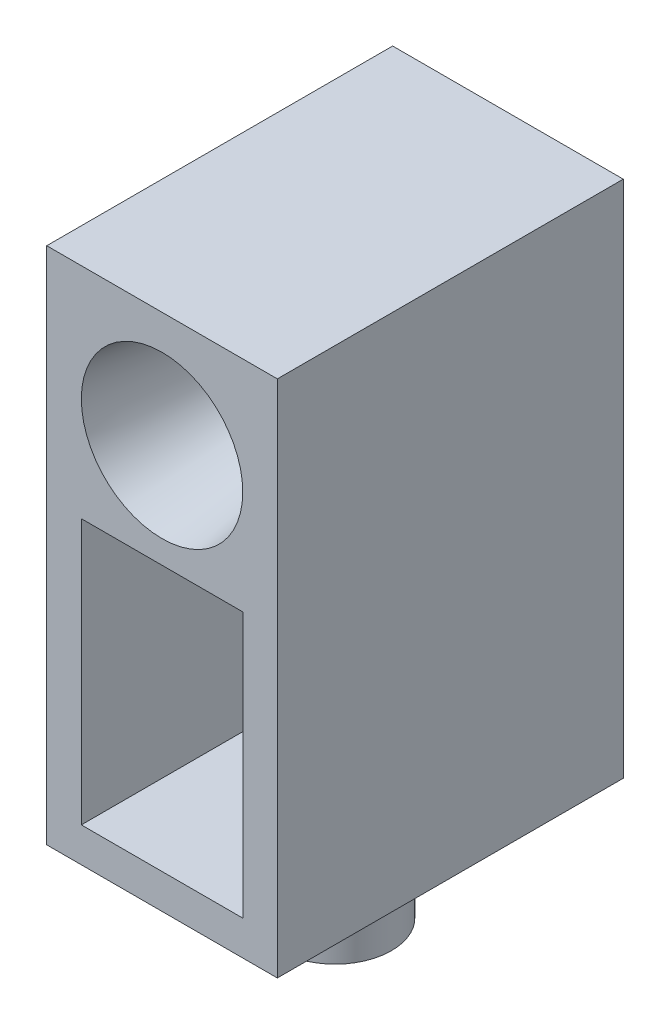
ISO-10303-21;
HEADER;
FILE_DESCRIPTION(('STEP AP214'),'2;1');
FILE_NAME('part.step','',(''),(''),'','','');
FILE_SCHEMA(('AUTOMOTIVE_DESIGN { 1 0 10303 214 1 1 1 1 }'));
ENDSEC;
DATA;
#1=APPLICATION_CONTEXT('core data for automotive mechanical design processes');
#2=APPLICATION_PROTOCOL_DEFINITION('international standard','automotive_design',2000,#1);
#3=PRODUCT_CONTEXT('',#1,'mechanical');
#4=PRODUCT('Part','Part','',(#3));
#5=PRODUCT_RELATED_PRODUCT_CATEGORY('part','',(#4));
#6=PRODUCT_DEFINITION_FORMATION('','',#4);
#7=PRODUCT_DEFINITION_CONTEXT('part definition',#1,'design');
#8=PRODUCT_DEFINITION('design','',#6,#7);
#9=PRODUCT_DEFINITION_SHAPE('','',#8);
#10=(LENGTH_UNIT() NAMED_UNIT(*) SI_UNIT(.MILLI.,.METRE.));
#11=(NAMED_UNIT(*) PLANE_ANGLE_UNIT() SI_UNIT($,.RADIAN.));
#12=(NAMED_UNIT(*) SI_UNIT($,.STERADIAN.) SOLID_ANGLE_UNIT());
#13=UNCERTAINTY_MEASURE_WITH_UNIT(LENGTH_MEASURE(1.E-05),#10,'distance_accuracy_value','');
#14=(GEOMETRIC_REPRESENTATION_CONTEXT(3) GLOBAL_UNCERTAINTY_ASSIGNED_CONTEXT((#13)) GLOBAL_UNIT_ASSIGNED_CONTEXT((#10,
#11,#12)) REPRESENTATION_CONTEXT('',''));
#15=CARTESIAN_POINT('',(0.,0.,0.));
#16=DIRECTION('',(0.,0.,1.));
#17=DIRECTION('',(1.,0.,0.));
#18=AXIS2_PLACEMENT_3D('',#15,#16,#17);
#19=CARTESIAN_POINT('',(10.,45.,15.));
#20=DIRECTION('',(-1.,0.,0.));
#21=DIRECTION('',(0.,0.,1.));
#22=AXIS2_PLACEMENT_3D('',#19,#20,#21);
#23=PLANE('',#22);
#24=DIRECTION('',(0.,0.,-1.));
#25=VECTOR('',#24,1.);
#26=CARTESIAN_POINT('',(10.,0.,15.));
#27=LINE('',#26,#25);
#28=CARTESIAN_POINT('',(10.,0.,15.));
#29=VERTEX_POINT('',#28);
#30=CARTESIAN_POINT('',(10.,0.,-15.));
#31=VERTEX_POINT('',#30);
#32=EDGE_CURVE('E157',#29,#31,#27,.T.);
#33=ORIENTED_EDGE('',*,*,#32,.T.);
#34=DIRECTION('',(0.,-1.,0.));
#35=VECTOR('',#34,1.);
#36=CARTESIAN_POINT('',(10.,45.,-15.));
#37=LINE('',#36,#35);
#38=CARTESIAN_POINT('',(10.,45.,-15.));
#39=VERTEX_POINT('',#38);
#40=EDGE_CURVE('E36',#39,#31,#37,.T.);
#41=ORIENTED_EDGE('',*,*,#40,.F.);
#42=DIRECTION('',(0.,0.,-1.));
#43=VECTOR('',#42,1.);
#44=CARTESIAN_POINT('',(10.,45.,15.));
#45=LINE('',#44,#43);
#46=CARTESIAN_POINT('',(10.,45.,15.));
#47=VERTEX_POINT('',#46);
#48=EDGE_CURVE('E159',#47,#39,#45,.T.);
#49=ORIENTED_EDGE('',*,*,#48,.F.);
#50=DIRECTION('',(0.,-1.,0.));
#51=VECTOR('',#50,1.);
#52=CARTESIAN_POINT('',(10.,45.,15.));
#53=LINE('',#52,#51);
#54=EDGE_CURVE('E169',#47,#29,#53,.T.);
#55=ORIENTED_EDGE('',*,*,#54,.T.);
#56=EDGE_LOOP('',(#33,#41,#49,#55));
#57=FACE_BOUND('',#56,.T.);
#58=ADVANCED_FACE('F33',(#57),#23,.F.);
#59=CARTESIAN_POINT('',(-10.,45.,-15.));
#60=DIRECTION('',(0.,0.,1.));
#61=DIRECTION('',(1.,0.,0.));
#62=AXIS2_PLACEMENT_3D('',#59,#60,#61);
#63=PLANE('',#62);
#64=DIRECTION('',(-1.,0.,0.));
#65=VECTOR('',#64,1.);
#66=CARTESIAN_POINT('',(-7.,26.,-15.));
#67=LINE('',#66,#65);
#68=CARTESIAN_POINT('',(7.,26.,-15.));
#69=VERTEX_POINT('',#68);
#70=CARTESIAN_POINT('',(-7.,26.,-15.));
#71=VERTEX_POINT('',#70);
#72=EDGE_CURVE('E106',#69,#71,#67,.T.);
#73=ORIENTED_EDGE('',*,*,#72,.T.);
#74=DIRECTION('',(0.,-1.,0.));
#75=VECTOR('',#74,1.);
#76=CARTESIAN_POINT('',(-7.,3.,-15.));
#77=LINE('',#76,#75);
#78=CARTESIAN_POINT('',(-7.,3.,-15.));
#79=VERTEX_POINT('',#78);
#80=EDGE_CURVE('E100',#71,#79,#77,.T.);
#81=ORIENTED_EDGE('',*,*,#80,.T.);
#82=DIRECTION('',(1.,0.,0.));
#83=VECTOR('',#82,1.);
#84=CARTESIAN_POINT('',(-7.,3.,-15.));
#85=LINE('',#84,#83);
#86=CARTESIAN_POINT('',(7.,3.,-15.));
#87=VERTEX_POINT('',#86);
#88=EDGE_CURVE('E109',#79,#87,#85,.T.);
#89=ORIENTED_EDGE('',*,*,#88,.T.);
#90=DIRECTION('',(0.,1.,0.));
#91=VECTOR('',#90,1.);
#92=CARTESIAN_POINT('',(7.,3.,-15.));
#93=LINE('',#92,#91);
#94=EDGE_CURVE('E48',#87,#69,#93,.T.);
#95=ORIENTED_EDGE('',*,*,#94,.T.);
#96=EDGE_LOOP('',(#73,#81,#89,#95));
#97=FACE_BOUND('',#96,.T.);
#98=CARTESIAN_POINT('',(-1.5,35.,-15.));
#99=DIRECTION('',(0.,0.,1.));
#100=DIRECTION('',(1.,0.,0.));
#101=AXIS2_PLACEMENT_3D('',#98,#99,#100);
#102=CIRCLE('',#101,0.5);
#103=CARTESIAN_POINT('',(-1.,35.,-15.));
#104=VERTEX_POINT('',#103);
#105=EDGE_CURVE('E135',#104,#104,#102,.T.);
#106=ORIENTED_EDGE('',*,*,#105,.T.);
#107=EDGE_LOOP('',(#106));
#108=FACE_BOUND('',#107,.T.);
#109=CARTESIAN_POINT('',(1.5,35.,-15.));
#110=DIRECTION('',(0.,0.,1.));
#111=DIRECTION('',(1.,0.,0.));
#112=AXIS2_PLACEMENT_3D('',#109,#110,#111);
#113=CIRCLE('',#112,0.5);
#114=CARTESIAN_POINT('',(2.,35.,-15.));
#115=VERTEX_POINT('',#114);
#116=EDGE_CURVE('E142',#115,#115,#113,.T.);
#117=ORIENTED_EDGE('',*,*,#116,.T.);
#118=EDGE_LOOP('',(#117));
#119=FACE_BOUND('',#118,.T.);
#120=DIRECTION('',(-1.,0.,0.));
#121=VECTOR('',#120,1.);
#122=CARTESIAN_POINT('',(-10.,0.,-15.));
#123=LINE('',#122,#121);
#124=CARTESIAN_POINT('',(-10.,0.,-15.));
#125=VERTEX_POINT('',#124);
#126=EDGE_CURVE('E172',#31,#125,#123,.T.);
#127=ORIENTED_EDGE('',*,*,#126,.T.);
#128=DIRECTION('',(0.,-1.,0.));
#129=VECTOR('',#128,1.);
#130=CARTESIAN_POINT('',(-10.,45.,-15.));
#131=LINE('',#130,#129);
#132=CARTESIAN_POINT('',(-10.,45.,-15.));
#133=VERTEX_POINT('',#132);
#134=EDGE_CURVE('E181',#133,#125,#131,.T.);
#135=ORIENTED_EDGE('',*,*,#134,.F.);
#136=DIRECTION('',(-1.,0.,0.));
#137=VECTOR('',#136,1.);
#138=CARTESIAN_POINT('',(-10.,45.,-15.));
#139=LINE('',#138,#137);
#140=EDGE_CURVE('E162',#39,#133,#139,.T.);
#141=ORIENTED_EDGE('',*,*,#140,.F.);
#142=ORIENTED_EDGE('',*,*,#40,.T.);
#143=EDGE_LOOP('',(#127,#135,#141,#142));
#144=FACE_BOUND('',#143,.T.);
#145=ADVANCED_FACE('F113',(#97,#108,#119,#144),#63,.F.);
#146=CARTESIAN_POINT('',(-10.,45.,15.));
#147=DIRECTION('',(1.,0.,0.));
#148=DIRECTION('',(0.,0.,-1.));
#149=AXIS2_PLACEMENT_3D('',#146,#147,#148);
#150=PLANE('',#149);
#151=DIRECTION('',(0.,0.,1.));
#152=VECTOR('',#151,1.);
#153=CARTESIAN_POINT('',(-10.,0.,15.));
#154=LINE('',#153,#152);
#155=CARTESIAN_POINT('',(-10.,0.,15.));
#156=VERTEX_POINT('',#155);
#157=EDGE_CURVE('E174',#125,#156,#154,.T.);
#158=ORIENTED_EDGE('',*,*,#157,.T.);
#159=DIRECTION('',(0.,-1.,0.));
#160=VECTOR('',#159,1.);
#161=CARTESIAN_POINT('',(-10.,45.,15.));
#162=LINE('',#161,#160);
#163=CARTESIAN_POINT('',(-10.,45.,15.));
#164=VERTEX_POINT('',#163);
#165=EDGE_CURVE('E179',#164,#156,#162,.T.);
#166=ORIENTED_EDGE('',*,*,#165,.F.);
#167=DIRECTION('',(0.,0.,1.));
#168=VECTOR('',#167,1.);
#169=CARTESIAN_POINT('',(-10.,45.,15.));
#170=LINE('',#169,#168);
#171=EDGE_CURVE('E165',#133,#164,#170,.T.);
#172=ORIENTED_EDGE('',*,*,#171,.F.);
#173=ORIENTED_EDGE('',*,*,#134,.T.);
#174=EDGE_LOOP('',(#158,#166,#172,#173));
#175=FACE_BOUND('',#174,.T.);
#176=ADVANCED_FACE('F198',(#175),#150,.F.);
#177=CARTESIAN_POINT('',(-10.,45.,15.));
#178=DIRECTION('',(0.,0.,-1.));
#179=DIRECTION('',(-1.,0.,0.));
#180=AXIS2_PLACEMENT_3D('',#177,#178,#179);
#181=PLANE('',#180);
#182=DIRECTION('',(1.,0.,0.));
#183=VECTOR('',#182,1.);
#184=CARTESIAN_POINT('',(-7.,3.,15.));
#185=LINE('',#184,#183);
#186=CARTESIAN_POINT('',(-7.,3.,15.));
#187=VERTEX_POINT('',#186);
#188=CARTESIAN_POINT('',(7.,3.,15.));
#189=VERTEX_POINT('',#188);
#190=EDGE_CURVE('E125',#187,#189,#185,.T.);
#191=ORIENTED_EDGE('',*,*,#190,.F.);
#192=DIRECTION('',(0.,-1.,0.));
#193=VECTOR('',#192,1.);
#194=CARTESIAN_POINT('',(-7.,3.,15.));
#195=LINE('',#194,#193);
#196=CARTESIAN_POINT('',(-7.,26.,15.));
#197=VERTEX_POINT('',#196);
#198=EDGE_CURVE('E56',#197,#187,#195,.T.);
#199=ORIENTED_EDGE('',*,*,#198,.F.);
#200=DIRECTION('',(-1.,0.,0.));
#201=VECTOR('',#200,1.);
#202=CARTESIAN_POINT('',(-7.,26.,15.));
#203=LINE('',#202,#201);
#204=CARTESIAN_POINT('',(7.,26.,15.));
#205=VERTEX_POINT('',#204);
#206=EDGE_CURVE('E116',#205,#197,#203,.T.);
#207=ORIENTED_EDGE('',*,*,#206,.F.);
#208=DIRECTION('',(0.,1.,0.));
#209=VECTOR('',#208,1.);
#210=CARTESIAN_POINT('',(7.,3.,15.));
#211=LINE('',#210,#209);
#212=EDGE_CURVE('E119',#189,#205,#211,.T.);
#213=ORIENTED_EDGE('',*,*,#212,.F.);
#214=EDGE_LOOP('',(#191,#199,#207,#213));
#215=FACE_BOUND('',#214,.T.);
#216=CARTESIAN_POINT('',(0.,35.,15.));
#217=DIRECTION('',(0.,0.,1.));
#218=DIRECTION('',(1.,0.,0.));
#219=AXIS2_PLACEMENT_3D('',#216,#217,#218);
#220=CIRCLE('',#219,7.);
#221=CARTESIAN_POINT('',(7.,35.,15.));
#222=VERTEX_POINT('',#221);
#223=EDGE_CURVE('E150',#222,#222,#220,.T.);
#224=ORIENTED_EDGE('',*,*,#223,.F.);
#225=EDGE_LOOP('',(#224));
#226=FACE_BOUND('',#225,.T.);
#227=DIRECTION('',(1.,0.,0.));
#228=VECTOR('',#227,1.);
#229=CARTESIAN_POINT('',(-10.,0.,15.));
#230=LINE('',#229,#228);
#231=EDGE_CURVE('E163',#156,#29,#230,.T.);
#232=ORIENTED_EDGE('',*,*,#231,.T.);
#233=ORIENTED_EDGE('',*,*,#54,.F.);
#234=DIRECTION('',(1.,0.,0.));
#235=VECTOR('',#234,1.);
#236=CARTESIAN_POINT('',(-10.,45.,15.));
#237=LINE('',#236,#235);
#238=EDGE_CURVE('E167',#164,#47,#237,.T.);
#239=ORIENTED_EDGE('',*,*,#238,.F.);
#240=ORIENTED_EDGE('',*,*,#165,.T.);
#241=EDGE_LOOP('',(#232,#233,#239,#240));
#242=FACE_BOUND('',#241,.T.);
#243=ADVANCED_FACE('F201',(#215,#226,#242),#181,.F.);
#244=CARTESIAN_POINT('',(0.,45.,0.));
#245=DIRECTION('',(0.,-1.,0.));
#246=DIRECTION('',(0.,0.,-1.));
#247=AXIS2_PLACEMENT_3D('',#244,#245,#246);
#248=PLANE('',#247);
#249=ORIENTED_EDGE('',*,*,#48,.T.);
#250=ORIENTED_EDGE('',*,*,#140,.T.);
#251=ORIENTED_EDGE('',*,*,#171,.T.);
#252=ORIENTED_EDGE('',*,*,#238,.T.);
#253=EDGE_LOOP('',(#249,#250,#251,#252));
#254=FACE_BOUND('',#253,.T.);
#255=ADVANCED_FACE('F203',(#254),#248,.F.);
#256=CARTESIAN_POINT('',(0.,0.,0.));
#257=DIRECTION('',(0.,-1.,0.));
#258=DIRECTION('',(0.,0.,-1.));
#259=AXIS2_PLACEMENT_3D('',#256,#257,#258);
#260=PLANE('',#259);
#261=CARTESIAN_POINT('',(0.,0.,0.));
#262=DIRECTION('',(0.,-1.,0.));
#263=DIRECTION('',(0.,0.,-1.));
#264=AXIS2_PLACEMENT_3D('',#261,#262,#263);
#265=CIRCLE('',#264,4.9);
#266=CARTESIAN_POINT('',(0.,0.,-4.9));
#267=VERTEX_POINT('',#266);
#268=EDGE_CURVE('E11',#267,#267,#265,.T.);
#269=ORIENTED_EDGE('',*,*,#268,.F.);
#270=EDGE_LOOP('',(#269));
#271=FACE_BOUND('',#270,.T.);
#272=ORIENTED_EDGE('',*,*,#32,.F.);
#273=ORIENTED_EDGE('',*,*,#231,.F.);
#274=ORIENTED_EDGE('',*,*,#157,.F.);
#275=ORIENTED_EDGE('',*,*,#126,.F.);
#276=EDGE_LOOP('',(#272,#273,#274,#275));
#277=FACE_BOUND('',#276,.T.);
#278=ADVANCED_FACE('F196',(#271,#277),#260,.T.);
#279=CARTESIAN_POINT('',(0.,-8.,0.));
#280=DIRECTION('',(0.,1.,0.));
#281=DIRECTION('',(0.,0.,1.));
#282=AXIS2_PLACEMENT_3D('',#279,#280,#281);
#283=CYLINDRICAL_SURFACE('',#282,4.9);
#284=CARTESIAN_POINT('',(0.,-8.,0.));
#285=DIRECTION('',(0.,-1.,0.));
#286=DIRECTION('',(0.,0.,-1.));
#287=AXIS2_PLACEMENT_3D('',#284,#285,#286);
#288=CIRCLE('',#287,4.9);
#289=CARTESIAN_POINT('',(0.,-8.,-4.9));
#290=VERTEX_POINT('',#289);
#291=EDGE_CURVE('E155',#290,#290,#288,.T.);
#292=ORIENTED_EDGE('',*,*,#291,.F.);
#293=EDGE_LOOP('',(#292));
#294=FACE_BOUND('',#293,.T.);
#295=ORIENTED_EDGE('',*,*,#268,.T.);
#296=EDGE_LOOP('',(#295));
#297=FACE_BOUND('',#296,.T.);
#298=ADVANCED_FACE('F210',(#294,#297),#283,.T.);
#299=CARTESIAN_POINT('',(0.,-8.,0.));
#300=DIRECTION('',(0.,-1.,0.));
#301=DIRECTION('',(0.,0.,-1.));
#302=AXIS2_PLACEMENT_3D('',#299,#300,#301);
#303=PLANE('',#302);
#304=ORIENTED_EDGE('',*,*,#291,.T.);
#305=EDGE_LOOP('',(#304));
#306=FACE_BOUND('',#305,.T.);
#307=ADVANCED_FACE('F294',(#306),#303,.T.);
#308=CARTESIAN_POINT('',(0.,35.,15.));
#309=DIRECTION('',(0.,0.,1.));
#310=DIRECTION('',(1.,0.,0.));
#311=AXIS2_PLACEMENT_3D('',#308,#309,#310);
#312=CONICAL_SURFACE('',#311,7.,0.15707963267949);
#313=CARTESIAN_POINT('',(0.,35.,-9.));
#314=DIRECTION('',(0.,0.,1.));
#315=DIRECTION('',(1.,0.,0.));
#316=AXIS2_PLACEMENT_3D('',#313,#314,#315);
#317=CIRCLE('',#316,3.19877343221113);
#318=CARTESIAN_POINT('',(3.19877343221113,35.,-9.));
#319=VERTEX_POINT('',#318);
#320=EDGE_CURVE('E138',#319,#319,#317,.T.);
#321=ORIENTED_EDGE('',*,*,#320,.F.);
#322=EDGE_LOOP('',(#321));
#323=FACE_BOUND('',#322,.T.);
#324=ORIENTED_EDGE('',*,*,#223,.T.);
#325=EDGE_LOOP('',(#324));
#326=FACE_BOUND('',#325,.T.);
#327=ADVANCED_FACE('F290',(#323,#326),#312,.F.);
#328=CARTESIAN_POINT('',(0.,35.,-12.));
#329=DIRECTION('',(0.,0.,1.));
#330=DIRECTION('',(1.,0.,0.));
#331=AXIS2_PLACEMENT_3D('',#328,#329,#330);
#332=CYLINDRICAL_SURFACE('',#331,3.19877343221113);
#333=CARTESIAN_POINT('',(0.,35.,-12.));
#334=DIRECTION('',(0.,0.,1.));
#335=DIRECTION('',(1.,0.,0.));
#336=AXIS2_PLACEMENT_3D('',#333,#334,#335);
#337=CIRCLE('',#336,3.19877343221113);
#338=CARTESIAN_POINT('',(3.19877343221113,35.,-12.));
#339=VERTEX_POINT('',#338);
#340=EDGE_CURVE('E147',#339,#339,#337,.T.);
#341=ORIENTED_EDGE('',*,*,#340,.F.);
#342=EDGE_LOOP('',(#341));
#343=FACE_BOUND('',#342,.T.);
#344=ORIENTED_EDGE('',*,*,#320,.T.);
#345=EDGE_LOOP('',(#344));
#346=FACE_BOUND('',#345,.T.);
#347=ADVANCED_FACE('F286',(#343,#346),#332,.F.);
#348=CARTESIAN_POINT('',(0.,35.,-12.));
#349=DIRECTION('',(0.,0.,1.));
#350=DIRECTION('',(1.,0.,0.));
#351=AXIS2_PLACEMENT_3D('',#348,#349,#350);
#352=PLANE('',#351);
#353=CARTESIAN_POINT('',(-1.5,35.,-12.));
#354=DIRECTION('',(0.,0.,1.));
#355=DIRECTION('',(1.,0.,0.));
#356=AXIS2_PLACEMENT_3D('',#353,#354,#355);
#357=CIRCLE('',#356,0.5);
#358=CARTESIAN_POINT('',(-1.,35.,-12.));
#359=VERTEX_POINT('',#358);
#360=EDGE_CURVE('E139',#359,#359,#357,.T.);
#361=ORIENTED_EDGE('',*,*,#360,.F.);
#362=EDGE_LOOP('',(#361));
#363=FACE_BOUND('',#362,.T.);
#364=CARTESIAN_POINT('',(1.5,35.,-12.));
#365=DIRECTION('',(0.,0.,1.));
#366=DIRECTION('',(1.,0.,0.));
#367=AXIS2_PLACEMENT_3D('',#364,#365,#366);
#368=CIRCLE('',#367,0.5);
#369=CARTESIAN_POINT('',(2.,35.,-12.));
#370=VERTEX_POINT('',#369);
#371=EDGE_CURVE('E131',#370,#370,#368,.T.);
#372=ORIENTED_EDGE('',*,*,#371,.F.);
#373=EDGE_LOOP('',(#372));
#374=FACE_BOUND('',#373,.T.);
#375=ORIENTED_EDGE('',*,*,#340,.T.);
#376=EDGE_LOOP('',(#375));
#377=FACE_BOUND('',#376,.T.);
#378=ADVANCED_FACE('F282',(#363,#374,#377),#352,.T.);
#379=CARTESIAN_POINT('',(1.5,35.,-15.));
#380=DIRECTION('',(0.,0.,1.));
#381=DIRECTION('',(1.,0.,0.));
#382=AXIS2_PLACEMENT_3D('',#379,#380,#381);
#383=CYLINDRICAL_SURFACE('',#382,0.5);
#384=ORIENTED_EDGE('',*,*,#116,.F.);
#385=EDGE_LOOP('',(#384));
#386=FACE_BOUND('',#385,.T.);
#387=ORIENTED_EDGE('',*,*,#371,.T.);
#388=EDGE_LOOP('',(#387));
#389=FACE_BOUND('',#388,.T.);
#390=ADVANCED_FACE('F278',(#386,#389),#383,.F.);
#391=CARTESIAN_POINT('',(-1.5,35.,-15.));
#392=DIRECTION('',(0.,0.,1.));
#393=DIRECTION('',(1.,0.,0.));
#394=AXIS2_PLACEMENT_3D('',#391,#392,#393);
#395=CYLINDRICAL_SURFACE('',#394,0.5);
#396=ORIENTED_EDGE('',*,*,#105,.F.);
#397=EDGE_LOOP('',(#396));
#398=FACE_BOUND('',#397,.T.);
#399=ORIENTED_EDGE('',*,*,#360,.T.);
#400=EDGE_LOOP('',(#399));
#401=FACE_BOUND('',#400,.T.);
#402=ADVANCED_FACE('F244',(#398,#401),#395,.F.);
#403=CARTESIAN_POINT('',(-7.,3.,-15.));
#404=DIRECTION('',(-1.,0.,0.));
#405=DIRECTION('',(0.,0.,1.));
#406=AXIS2_PLACEMENT_3D('',#403,#404,#405);
#407=PLANE('',#406);
#408=ORIENTED_EDGE('',*,*,#198,.T.);
#409=DIRECTION('',(0.,0.,1.));
#410=VECTOR('',#409,1.);
#411=CARTESIAN_POINT('',(-7.,3.,-15.));
#412=LINE('',#411,#410);
#413=EDGE_CURVE('E96',#79,#187,#412,.T.);
#414=ORIENTED_EDGE('',*,*,#413,.F.);
#415=ORIENTED_EDGE('',*,*,#80,.F.);
#416=DIRECTION('',(0.,0.,1.));
#417=VECTOR('',#416,1.);
#418=CARTESIAN_POINT('',(-7.,26.,-15.));
#419=LINE('',#418,#417);
#420=EDGE_CURVE('E129',#71,#197,#419,.T.);
#421=ORIENTED_EDGE('',*,*,#420,.T.);
#422=EDGE_LOOP('',(#408,#414,#415,#421));
#423=FACE_BOUND('',#422,.T.);
#424=ADVANCED_FACE('F98',(#423),#407,.F.);
#425=CARTESIAN_POINT('',(-7.,26.,-15.));
#426=DIRECTION('',(0.,1.,0.));
#427=DIRECTION('',(0.,0.,1.));
#428=AXIS2_PLACEMENT_3D('',#425,#426,#427);
#429=PLANE('',#428);
#430=ORIENTED_EDGE('',*,*,#206,.T.);
#431=ORIENTED_EDGE('',*,*,#420,.F.);
#432=ORIENTED_EDGE('',*,*,#72,.F.);
#433=DIRECTION('',(0.,0.,1.));
#434=VECTOR('',#433,1.);
#435=CARTESIAN_POINT('',(7.,26.,-15.));
#436=LINE('',#435,#434);
#437=EDGE_CURVE('E132',#69,#205,#436,.T.);
#438=ORIENTED_EDGE('',*,*,#437,.T.);
#439=EDGE_LOOP('',(#430,#431,#432,#438));
#440=FACE_BOUND('',#439,.T.);
#441=ADVANCED_FACE('F243',(#440),#429,.F.);
#442=CARTESIAN_POINT('',(7.,3.,-15.));
#443=DIRECTION('',(1.,0.,0.));
#444=DIRECTION('',(0.,0.,-1.));
#445=AXIS2_PLACEMENT_3D('',#442,#443,#444);
#446=PLANE('',#445);
#447=ORIENTED_EDGE('',*,*,#212,.T.);
#448=ORIENTED_EDGE('',*,*,#437,.F.);
#449=ORIENTED_EDGE('',*,*,#94,.F.);
#450=DIRECTION('',(0.,0.,1.));
#451=VECTOR('',#450,1.);
#452=CARTESIAN_POINT('',(7.,3.,-15.));
#453=LINE('',#452,#451);
#454=EDGE_CURVE('E105',#87,#189,#453,.T.);
#455=ORIENTED_EDGE('',*,*,#454,.T.);
#456=EDGE_LOOP('',(#447,#448,#449,#455));
#457=FACE_BOUND('',#456,.T.);
#458=ADVANCED_FACE('F255',(#457),#446,.F.);
#459=CARTESIAN_POINT('',(-7.,3.,-15.));
#460=DIRECTION('',(0.,-1.,0.));
#461=DIRECTION('',(0.,0.,-1.));
#462=AXIS2_PLACEMENT_3D('',#459,#460,#461);
#463=PLANE('',#462);
#464=ORIENTED_EDGE('',*,*,#190,.T.);
#465=ORIENTED_EDGE('',*,*,#454,.F.);
#466=ORIENTED_EDGE('',*,*,#88,.F.);
#467=ORIENTED_EDGE('',*,*,#413,.T.);
#468=EDGE_LOOP('',(#464,#465,#466,#467));
#469=FACE_BOUND('',#468,.T.);
#470=ADVANCED_FACE('F110',(#469),#463,.F.);
#471=CLOSED_SHELL('',(#58,#145,#176,#243,#255,#278,#298,#307,#327,#347,#378,#390,#402,#424,#441,
#458,#470));
#472=MANIFOLD_SOLID_BREP('B2',#471);
#473=ADVANCED_BREP_SHAPE_REPRESENTATION('',(#18,#472),#14);
#474=SHAPE_DEFINITION_REPRESENTATION(#9,#473);
ENDSEC;
END-ISO-10303-21;
